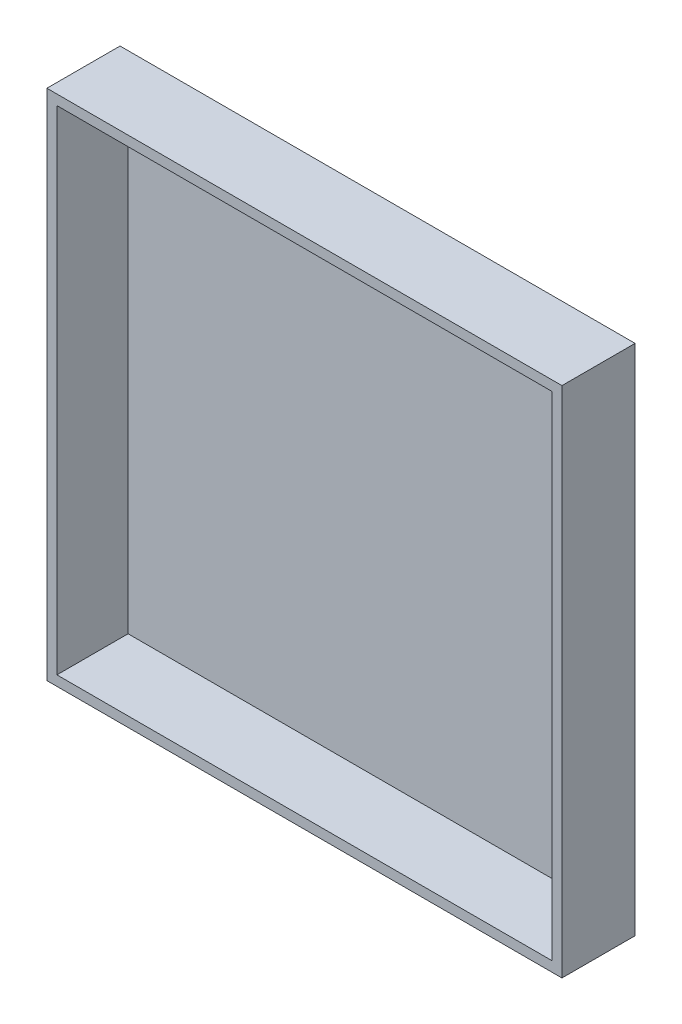
ISO-10303-21;
HEADER;
FILE_DESCRIPTION(('STEP AP214'),'2;1');
FILE_NAME('part.step','',(''),(''),'','','');
FILE_SCHEMA(('AUTOMOTIVE_DESIGN { 1 0 10303 214 1 1 1 1 }'));
ENDSEC;
DATA;
#1=APPLICATION_CONTEXT('core data for automotive mechanical design processes');
#2=APPLICATION_PROTOCOL_DEFINITION('international standard','automotive_design',2000,#1);
#3=PRODUCT_CONTEXT('',#1,'mechanical');
#4=PRODUCT('Part','Part','',(#3));
#5=PRODUCT_RELATED_PRODUCT_CATEGORY('part','',(#4));
#6=PRODUCT_DEFINITION_FORMATION('','',#4);
#7=PRODUCT_DEFINITION_CONTEXT('part definition',#1,'design');
#8=PRODUCT_DEFINITION('design','',#6,#7);
#9=PRODUCT_DEFINITION_SHAPE('','',#8);
#10=(LENGTH_UNIT() NAMED_UNIT(*) SI_UNIT(.MILLI.,.METRE.));
#11=(NAMED_UNIT(*) PLANE_ANGLE_UNIT() SI_UNIT($,.RADIAN.));
#12=(NAMED_UNIT(*) SI_UNIT($,.STERADIAN.) SOLID_ANGLE_UNIT());
#13=UNCERTAINTY_MEASURE_WITH_UNIT(LENGTH_MEASURE(1.E-05),#10,'distance_accuracy_value','');
#14=(GEOMETRIC_REPRESENTATION_CONTEXT(3) GLOBAL_UNCERTAINTY_ASSIGNED_CONTEXT((#13)) GLOBAL_UNIT_ASSIGNED_CONTEXT((#10,
#11,#12)) REPRESENTATION_CONTEXT('',''));
#15=CARTESIAN_POINT('',(0.,0.,0.));
#16=DIRECTION('',(0.,0.,1.));
#17=DIRECTION('',(1.,0.,0.));
#18=AXIS2_PLACEMENT_3D('',#15,#16,#17);
#19=CARTESIAN_POINT('',(0.,0.,71.));
#20=DIRECTION('',(0.,0.,1.));
#21=DIRECTION('',(1.,0.,0.));
#22=AXIS2_PLACEMENT_3D('',#19,#20,#21);
#23=PLANE('',#22);
#24=DIRECTION('',(0.,1.,0.));
#25=VECTOR('',#24,1.);
#26=CARTESIAN_POINT('',(257.,246.,71.));
#27=LINE('',#26,#25);
#28=CARTESIAN_POINT('',(257.,-256.,71.));
#29=VERTEX_POINT('',#28);
#30=CARTESIAN_POINT('',(257.,256.,71.));
#31=VERTEX_POINT('',#30);
#32=EDGE_CURVE('E182',#29,#31,#27,.T.);
#33=ORIENTED_EDGE('',*,*,#32,.T.);
#34=DIRECTION('',(-1.,0.,0.));
#35=VECTOR('',#34,1.);
#36=CARTESIAN_POINT('',(-247.,256.,71.));
#37=LINE('',#36,#35);
#38=CARTESIAN_POINT('',(-257.,256.,71.));
#39=VERTEX_POINT('',#38);
#40=EDGE_CURVE('E184',#31,#39,#37,.T.);
#41=ORIENTED_EDGE('',*,*,#40,.T.);
#42=DIRECTION('',(0.,-1.,0.));
#43=VECTOR('',#42,1.);
#44=CARTESIAN_POINT('',(-257.,246.,71.));
#45=LINE('',#44,#43);
#46=CARTESIAN_POINT('',(-257.,-256.,71.));
#47=VERTEX_POINT('',#46);
#48=EDGE_CURVE('E133',#39,#47,#45,.T.);
#49=ORIENTED_EDGE('',*,*,#48,.T.);
#50=DIRECTION('',(1.,0.,0.));
#51=VECTOR('',#50,1.);
#52=CARTESIAN_POINT('',(-247.,-256.,71.));
#53=LINE('',#52,#51);
#54=EDGE_CURVE('E86',#47,#29,#53,.T.);
#55=ORIENTED_EDGE('',*,*,#54,.T.);
#56=EDGE_LOOP('',(#33,#41,#49,#55));
#57=FACE_BOUND('',#56,.T.);
#58=DIRECTION('',(-1.,0.,0.));
#59=VECTOR('',#58,1.);
#60=CARTESIAN_POINT('',(-247.,246.,71.));
#61=LINE('',#60,#59);
#62=CARTESIAN_POINT('',(247.,246.,71.));
#63=VERTEX_POINT('',#62);
#64=CARTESIAN_POINT('',(-247.,246.,71.));
#65=VERTEX_POINT('',#64);
#66=EDGE_CURVE('E157',#63,#65,#61,.T.);
#67=ORIENTED_EDGE('',*,*,#66,.F.);
#68=DIRECTION('',(0.,1.,0.));
#69=VECTOR('',#68,1.);
#70=CARTESIAN_POINT('',(247.,246.,71.));
#71=LINE('',#70,#69);
#72=CARTESIAN_POINT('',(247.,-246.,71.));
#73=VERTEX_POINT('',#72);
#74=EDGE_CURVE('E155',#73,#63,#71,.T.);
#75=ORIENTED_EDGE('',*,*,#74,.F.);
#76=DIRECTION('',(1.,0.,0.));
#77=VECTOR('',#76,1.);
#78=CARTESIAN_POINT('',(-247.,-246.,71.));
#79=LINE('',#78,#77);
#80=CARTESIAN_POINT('',(-247.,-246.,71.));
#81=VERTEX_POINT('',#80);
#82=EDGE_CURVE('E162',#81,#73,#79,.T.);
#83=ORIENTED_EDGE('',*,*,#82,.F.);
#84=DIRECTION('',(0.,-1.,0.));
#85=VECTOR('',#84,1.);
#86=CARTESIAN_POINT('',(-247.,246.,71.));
#87=LINE('',#86,#85);
#88=EDGE_CURVE('E160',#65,#81,#87,.T.);
#89=ORIENTED_EDGE('',*,*,#88,.F.);
#90=EDGE_LOOP('',(#67,#75,#83,#89));
#91=FACE_BOUND('',#90,.T.);
#92=ADVANCED_FACE('F63',(#57,#91),#23,.T.);
#93=CARTESIAN_POINT('',(257.,246.,71.));
#94=DIRECTION('',(-1.,0.,0.));
#95=DIRECTION('',(0.,-1.,0.));
#96=AXIS2_PLACEMENT_3D('',#93,#94,#95);
#97=PLANE('',#96);
#98=DIRECTION('',(0.,0.,-1.));
#99=VECTOR('',#98,1.);
#100=CARTESIAN_POINT('',(257.,-256.,71.));
#101=LINE('',#100,#99);
#102=CARTESIAN_POINT('',(257.,-256.,-2.));
#103=VERTEX_POINT('',#102);
#104=EDGE_CURVE('E188',#29,#103,#101,.T.);
#105=ORIENTED_EDGE('',*,*,#104,.T.);
#106=DIRECTION('',(0.,1.,0.));
#107=VECTOR('',#106,1.);
#108=CARTESIAN_POINT('',(257.,-256.,-2.));
#109=LINE('',#108,#107);
#110=CARTESIAN_POINT('',(257.,256.,-2.));
#111=VERTEX_POINT('',#110);
#112=EDGE_CURVE('E152',#103,#111,#109,.T.);
#113=ORIENTED_EDGE('',*,*,#112,.T.);
#114=DIRECTION('',(0.,0.,-1.));
#115=VECTOR('',#114,1.);
#116=CARTESIAN_POINT('',(257.,256.,71.));
#117=LINE('',#116,#115);
#118=EDGE_CURVE('E12',#31,#111,#117,.T.);
#119=ORIENTED_EDGE('',*,*,#118,.F.);
#120=ORIENTED_EDGE('',*,*,#32,.F.);
#121=EDGE_LOOP('',(#105,#113,#119,#120));
#122=FACE_BOUND('',#121,.T.);
#123=ADVANCED_FACE('F65',(#122),#97,.F.);
#124=CARTESIAN_POINT('',(-247.,256.,71.));
#125=DIRECTION('',(0.,-1.,0.));
#126=DIRECTION('',(0.,0.,-1.));
#127=AXIS2_PLACEMENT_3D('',#124,#125,#126);
#128=PLANE('',#127);
#129=ORIENTED_EDGE('',*,*,#118,.T.);
#130=DIRECTION('',(-1.,0.,0.));
#131=VECTOR('',#130,1.);
#132=CARTESIAN_POINT('',(257.,256.,-2.));
#133=LINE('',#132,#131);
#134=CARTESIAN_POINT('',(-257.,256.,-2.));
#135=VERTEX_POINT('',#134);
#136=EDGE_CURVE('E142',#111,#135,#133,.T.);
#137=ORIENTED_EDGE('',*,*,#136,.T.);
#138=DIRECTION('',(0.,0.,-1.));
#139=VECTOR('',#138,1.);
#140=CARTESIAN_POINT('',(-257.,256.,71.));
#141=LINE('',#140,#139);
#142=EDGE_CURVE('E71',#39,#135,#141,.T.);
#143=ORIENTED_EDGE('',*,*,#142,.F.);
#144=ORIENTED_EDGE('',*,*,#40,.F.);
#145=EDGE_LOOP('',(#129,#137,#143,#144));
#146=FACE_BOUND('',#145,.T.);
#147=ADVANCED_FACE('F147',(#146),#128,.F.);
#148=CARTESIAN_POINT('',(-257.,246.,71.));
#149=DIRECTION('',(1.,0.,0.));
#150=DIRECTION('',(0.,1.,0.));
#151=AXIS2_PLACEMENT_3D('',#148,#149,#150);
#152=PLANE('',#151);
#153=ORIENTED_EDGE('',*,*,#142,.T.);
#154=DIRECTION('',(0.,-1.,0.));
#155=VECTOR('',#154,1.);
#156=CARTESIAN_POINT('',(-257.,256.,-2.));
#157=LINE('',#156,#155);
#158=CARTESIAN_POINT('',(-257.,-256.,-2.));
#159=VERTEX_POINT('',#158);
#160=EDGE_CURVE('E132',#135,#159,#157,.T.);
#161=ORIENTED_EDGE('',*,*,#160,.T.);
#162=DIRECTION('',(0.,0.,-1.));
#163=VECTOR('',#162,1.);
#164=CARTESIAN_POINT('',(-257.,-256.,71.));
#165=LINE('',#164,#163);
#166=EDGE_CURVE('E136',#47,#159,#165,.T.);
#167=ORIENTED_EDGE('',*,*,#166,.F.);
#168=ORIENTED_EDGE('',*,*,#48,.F.);
#169=EDGE_LOOP('',(#153,#161,#167,#168));
#170=FACE_BOUND('',#169,.T.);
#171=ADVANCED_FACE('F130',(#170),#152,.F.);
#172=CARTESIAN_POINT('',(-247.,-256.,71.));
#173=DIRECTION('',(0.,1.,0.));
#174=DIRECTION('',(0.,0.,1.));
#175=AXIS2_PLACEMENT_3D('',#172,#173,#174);
#176=PLANE('',#175);
#177=ORIENTED_EDGE('',*,*,#166,.T.);
#178=DIRECTION('',(1.,0.,0.));
#179=VECTOR('',#178,1.);
#180=CARTESIAN_POINT('',(-257.,-256.,-2.));
#181=LINE('',#180,#179);
#182=EDGE_CURVE('E145',#159,#103,#181,.T.);
#183=ORIENTED_EDGE('',*,*,#182,.T.);
#184=ORIENTED_EDGE('',*,*,#104,.F.);
#185=ORIENTED_EDGE('',*,*,#54,.F.);
#186=EDGE_LOOP('',(#177,#183,#184,#185));
#187=FACE_BOUND('',#186,.T.);
#188=ADVANCED_FACE('F191',(#187),#176,.F.);
#189=CARTESIAN_POINT('',(247.,246.,71.));
#190=DIRECTION('',(-1.,0.,0.));
#191=DIRECTION('',(0.,-1.,0.));
#192=AXIS2_PLACEMENT_3D('',#189,#190,#191);
#193=PLANE('',#192);
#194=DIRECTION('',(0.,1.,0.));
#195=VECTOR('',#194,1.);
#196=CARTESIAN_POINT('',(247.,246.,0.));
#197=LINE('',#196,#195);
#198=CARTESIAN_POINT('',(247.,-246.,0.));
#199=VERTEX_POINT('',#198);
#200=CARTESIAN_POINT('',(247.,246.,0.));
#201=VERTEX_POINT('',#200);
#202=EDGE_CURVE('E154',#199,#201,#197,.T.);
#203=ORIENTED_EDGE('',*,*,#202,.F.);
#204=DIRECTION('',(0.,0.,-1.));
#205=VECTOR('',#204,1.);
#206=CARTESIAN_POINT('',(247.,-246.,71.));
#207=LINE('',#206,#205);
#208=EDGE_CURVE('E164',#73,#199,#207,.T.);
#209=ORIENTED_EDGE('',*,*,#208,.F.);
#210=ORIENTED_EDGE('',*,*,#74,.T.);
#211=DIRECTION('',(0.,0.,-1.));
#212=VECTOR('',#211,1.);
#213=CARTESIAN_POINT('',(247.,246.,71.));
#214=LINE('',#213,#212);
#215=EDGE_CURVE('E179',#63,#201,#214,.T.);
#216=ORIENTED_EDGE('',*,*,#215,.T.);
#217=EDGE_LOOP('',(#203,#209,#210,#216));
#218=FACE_BOUND('',#217,.T.);
#219=ADVANCED_FACE('F212',(#218),#193,.T.);
#220=CARTESIAN_POINT('',(-247.,246.,71.));
#221=DIRECTION('',(0.,-1.,0.));
#222=DIRECTION('',(0.,0.,-1.));
#223=AXIS2_PLACEMENT_3D('',#220,#221,#222);
#224=PLANE('',#223);
#225=DIRECTION('',(-1.,0.,0.));
#226=VECTOR('',#225,1.);
#227=CARTESIAN_POINT('',(-247.,246.,0.));
#228=LINE('',#227,#226);
#229=CARTESIAN_POINT('',(-247.,246.,0.));
#230=VERTEX_POINT('',#229);
#231=EDGE_CURVE('E167',#201,#230,#228,.T.);
#232=ORIENTED_EDGE('',*,*,#231,.F.);
#233=ORIENTED_EDGE('',*,*,#215,.F.);
#234=ORIENTED_EDGE('',*,*,#66,.T.);
#235=DIRECTION('',(0.,0.,-1.));
#236=VECTOR('',#235,1.);
#237=CARTESIAN_POINT('',(-247.,246.,71.));
#238=LINE('',#237,#236);
#239=EDGE_CURVE('E177',#65,#230,#238,.T.);
#240=ORIENTED_EDGE('',*,*,#239,.T.);
#241=EDGE_LOOP('',(#232,#233,#234,#240));
#242=FACE_BOUND('',#241,.T.);
#243=ADVANCED_FACE('F204',(#242),#224,.T.);
#244=CARTESIAN_POINT('',(-247.,246.,71.));
#245=DIRECTION('',(1.,0.,0.));
#246=DIRECTION('',(0.,1.,0.));
#247=AXIS2_PLACEMENT_3D('',#244,#245,#246);
#248=PLANE('',#247);
#249=DIRECTION('',(0.,-1.,0.));
#250=VECTOR('',#249,1.);
#251=CARTESIAN_POINT('',(-247.,246.,0.));
#252=LINE('',#251,#250);
#253=CARTESIAN_POINT('',(-247.,-246.,0.));
#254=VERTEX_POINT('',#253);
#255=EDGE_CURVE('E170',#230,#254,#252,.T.);
#256=ORIENTED_EDGE('',*,*,#255,.F.);
#257=ORIENTED_EDGE('',*,*,#239,.F.);
#258=ORIENTED_EDGE('',*,*,#88,.T.);
#259=DIRECTION('',(0.,0.,-1.));
#260=VECTOR('',#259,1.);
#261=CARTESIAN_POINT('',(-247.,-246.,71.));
#262=LINE('',#261,#260);
#263=EDGE_CURVE('E78',#81,#254,#262,.T.);
#264=ORIENTED_EDGE('',*,*,#263,.T.);
#265=EDGE_LOOP('',(#256,#257,#258,#264));
#266=FACE_BOUND('',#265,.T.);
#267=ADVANCED_FACE('F207',(#266),#248,.T.);
#268=CARTESIAN_POINT('',(-247.,-246.,71.));
#269=DIRECTION('',(0.,1.,0.));
#270=DIRECTION('',(0.,0.,1.));
#271=AXIS2_PLACEMENT_3D('',#268,#269,#270);
#272=PLANE('',#271);
#273=DIRECTION('',(1.,0.,0.));
#274=VECTOR('',#273,1.);
#275=CARTESIAN_POINT('',(-247.,-246.,0.));
#276=LINE('',#275,#274);
#277=EDGE_CURVE('E158',#254,#199,#276,.T.);
#278=ORIENTED_EDGE('',*,*,#277,.F.);
#279=ORIENTED_EDGE('',*,*,#263,.F.);
#280=ORIENTED_EDGE('',*,*,#82,.T.);
#281=ORIENTED_EDGE('',*,*,#208,.T.);
#282=EDGE_LOOP('',(#278,#279,#280,#281));
#283=FACE_BOUND('',#282,.T.);
#284=ADVANCED_FACE('F214',(#283),#272,.T.);
#285=CARTESIAN_POINT('',(0.,0.,0.));
#286=DIRECTION('',(0.,0.,1.));
#287=DIRECTION('',(1.,0.,0.));
#288=AXIS2_PLACEMENT_3D('',#285,#286,#287);
#289=PLANE('',#288);
#290=ORIENTED_EDGE('',*,*,#277,.T.);
#291=ORIENTED_EDGE('',*,*,#202,.T.);
#292=ORIENTED_EDGE('',*,*,#231,.T.);
#293=ORIENTED_EDGE('',*,*,#255,.T.);
#294=EDGE_LOOP('',(#290,#291,#292,#293));
#295=FACE_BOUND('',#294,.T.);
#296=ADVANCED_FACE('F209',(#295),#289,.T.);
#297=CARTESIAN_POINT('',(0.,0.,-2.));
#298=DIRECTION('',(0.,0.,1.));
#299=DIRECTION('',(1.,0.,0.));
#300=AXIS2_PLACEMENT_3D('',#297,#298,#299);
#301=PLANE('',#300);
#302=ORIENTED_EDGE('',*,*,#136,.F.);
#303=ORIENTED_EDGE('',*,*,#112,.F.);
#304=ORIENTED_EDGE('',*,*,#182,.F.);
#305=ORIENTED_EDGE('',*,*,#160,.F.);
#306=EDGE_LOOP('',(#302,#303,#304,#305));
#307=FACE_BOUND('',#306,.T.);
#308=ADVANCED_FACE('F140',(#307),#301,.F.);
#309=CLOSED_SHELL('',(#92,#123,#147,#171,#188,#219,#243,#267,#284,#296,#308));
#310=MANIFOLD_SOLID_BREP('B2',#309);
#311=ADVANCED_BREP_SHAPE_REPRESENTATION('',(#18,#310),#14);
#312=SHAPE_DEFINITION_REPRESENTATION(#9,#311);
ENDSEC;
END-ISO-10303-21;
